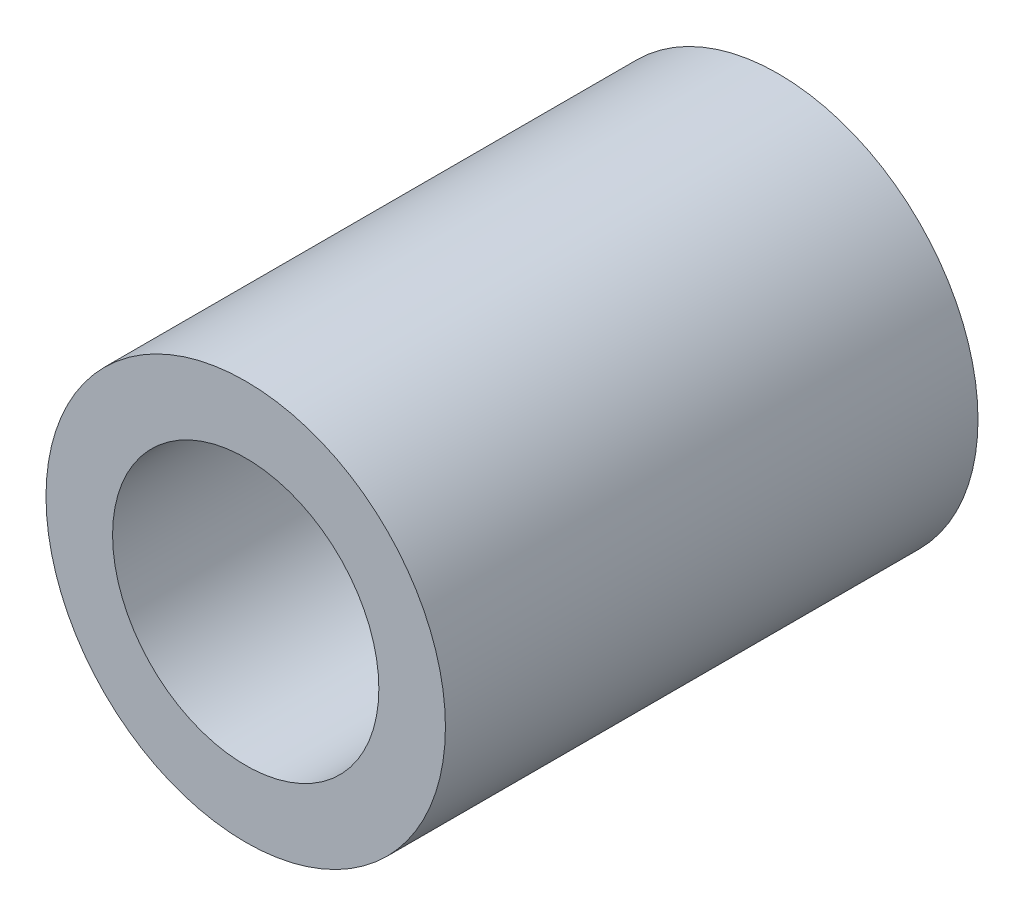
ISO-10303-21;
HEADER;
FILE_DESCRIPTION(('STEP AP214'),'2;1');
FILE_NAME('part.step','',(''),(''),'','','');
FILE_SCHEMA(('AUTOMOTIVE_DESIGN { 1 0 10303 214 1 1 1 1 }'));
ENDSEC;
DATA;
#1=APPLICATION_CONTEXT('core data for automotive mechanical design processes');
#2=APPLICATION_PROTOCOL_DEFINITION('international standard','automotive_design',2000,#1);
#3=PRODUCT_CONTEXT('',#1,'mechanical');
#4=PRODUCT('Part','Part','',(#3));
#5=PRODUCT_RELATED_PRODUCT_CATEGORY('part','',(#4));
#6=PRODUCT_DEFINITION_FORMATION('','',#4);
#7=PRODUCT_DEFINITION_CONTEXT('part definition',#1,'design');
#8=PRODUCT_DEFINITION('design','',#6,#7);
#9=PRODUCT_DEFINITION_SHAPE('','',#8);
#10=(LENGTH_UNIT() NAMED_UNIT(*) SI_UNIT(.MILLI.,.METRE.));
#11=(NAMED_UNIT(*) PLANE_ANGLE_UNIT() SI_UNIT($,.RADIAN.));
#12=(NAMED_UNIT(*) SI_UNIT($,.STERADIAN.) SOLID_ANGLE_UNIT());
#13=UNCERTAINTY_MEASURE_WITH_UNIT(LENGTH_MEASURE(1.E-05),#10,'distance_accuracy_value','');
#14=(GEOMETRIC_REPRESENTATION_CONTEXT(3) GLOBAL_UNCERTAINTY_ASSIGNED_CONTEXT((#13)) GLOBAL_UNIT_ASSIGNED_CONTEXT((#10,
#11,#12)) REPRESENTATION_CONTEXT('',''));
#15=CARTESIAN_POINT('',(0.,0.,0.));
#16=DIRECTION('',(0.,0.,1.));
#17=DIRECTION('',(1.,0.,0.));
#18=AXIS2_PLACEMENT_3D('',#15,#16,#17);
#19=CARTESIAN_POINT('',(0.,0.,16.));
#20=DIRECTION('',(0.,0.,1.));
#21=DIRECTION('',(1.,0.,0.));
#22=AXIS2_PLACEMENT_3D('',#19,#20,#21);
#23=PLANE('',#22);
#24=CARTESIAN_POINT('',(0.,0.,16.));
#25=DIRECTION('',(0.,0.,1.));
#26=DIRECTION('',(1.,0.,0.));
#27=AXIS2_PLACEMENT_3D('',#24,#25,#26);
#28=CIRCLE('',#27,6.);
#29=CARTESIAN_POINT('',(6.,0.,16.));
#30=VERTEX_POINT('',#29);
#31=EDGE_CURVE('E10',#30,#30,#28,.T.);
#32=ORIENTED_EDGE('',*,*,#31,.T.);
#33=EDGE_LOOP('',(#32));
#34=FACE_BOUND('',#33,.T.);
#35=CARTESIAN_POINT('',(0.,0.,16.));
#36=DIRECTION('',(0.,0.,1.));
#37=DIRECTION('',(1.,0.,0.));
#38=AXIS2_PLACEMENT_3D('',#35,#36,#37);
#39=CIRCLE('',#38,4.);
#40=CARTESIAN_POINT('',(4.,0.,16.));
#41=VERTEX_POINT('',#40);
#42=EDGE_CURVE('E43',#41,#41,#39,.T.);
#43=ORIENTED_EDGE('',*,*,#42,.F.);
#44=EDGE_LOOP('',(#43));
#45=FACE_BOUND('',#44,.T.);
#46=ADVANCED_FACE('F32',(#34,#45),#23,.T.);
#47=CARTESIAN_POINT('',(0.,0.,0.));
#48=DIRECTION('',(0.,0.,1.));
#49=DIRECTION('',(1.,0.,0.));
#50=AXIS2_PLACEMENT_3D('',#47,#48,#49);
#51=PLANE('',#50);
#52=CARTESIAN_POINT('',(0.,0.,0.));
#53=DIRECTION('',(0.,0.,1.));
#54=DIRECTION('',(1.,0.,0.));
#55=AXIS2_PLACEMENT_3D('',#52,#53,#54);
#56=CIRCLE('',#55,6.);
#57=CARTESIAN_POINT('',(6.,0.,0.));
#58=VERTEX_POINT('',#57);
#59=EDGE_CURVE('E36',#58,#58,#56,.T.);
#60=ORIENTED_EDGE('',*,*,#59,.F.);
#61=EDGE_LOOP('',(#60));
#62=FACE_BOUND('',#61,.T.);
#63=CARTESIAN_POINT('',(0.,0.,0.));
#64=DIRECTION('',(0.,0.,1.));
#65=DIRECTION('',(1.,0.,0.));
#66=AXIS2_PLACEMENT_3D('',#63,#64,#65);
#67=CIRCLE('',#66,4.);
#68=CARTESIAN_POINT('',(4.,0.,0.));
#69=VERTEX_POINT('',#68);
#70=EDGE_CURVE('E45',#69,#69,#67,.T.);
#71=ORIENTED_EDGE('',*,*,#70,.T.);
#72=EDGE_LOOP('',(#71));
#73=FACE_BOUND('',#72,.T.);
#74=ADVANCED_FACE('F55',(#62,#73),#51,.F.);
#75=CARTESIAN_POINT('',(0.,0.,16.));
#76=DIRECTION('',(0.,0.,-1.));
#77=DIRECTION('',(-1.,0.,0.));
#78=AXIS2_PLACEMENT_3D('',#75,#76,#77);
#79=CYLINDRICAL_SURFACE('',#78,6.);
#80=ORIENTED_EDGE('',*,*,#31,.F.);
#81=EDGE_LOOP('',(#80));
#82=FACE_BOUND('',#81,.T.);
#83=ORIENTED_EDGE('',*,*,#59,.T.);
#84=EDGE_LOOP('',(#83));
#85=FACE_BOUND('',#84,.T.);
#86=ADVANCED_FACE('F34',(#82,#85),#79,.T.);
#87=CARTESIAN_POINT('',(0.,0.,16.));
#88=DIRECTION('',(0.,0.,-1.));
#89=DIRECTION('',(-1.,0.,0.));
#90=AXIS2_PLACEMENT_3D('',#87,#88,#89);
#91=CYLINDRICAL_SURFACE('',#90,4.);
#92=ORIENTED_EDGE('',*,*,#42,.T.);
#93=EDGE_LOOP('',(#92));
#94=FACE_BOUND('',#93,.T.);
#95=ORIENTED_EDGE('',*,*,#70,.F.);
#96=EDGE_LOOP('',(#95));
#97=FACE_BOUND('',#96,.T.);
#98=ADVANCED_FACE('F51',(#94,#97),#91,.F.);
#99=CLOSED_SHELL('',(#46,#74,#86,#98));
#100=MANIFOLD_SOLID_BREP('B2',#99);
#101=ADVANCED_BREP_SHAPE_REPRESENTATION('',(#18,#100),#14);
#102=SHAPE_DEFINITION_REPRESENTATION(#9,#101);
ENDSEC;
END-ISO-10303-21;
